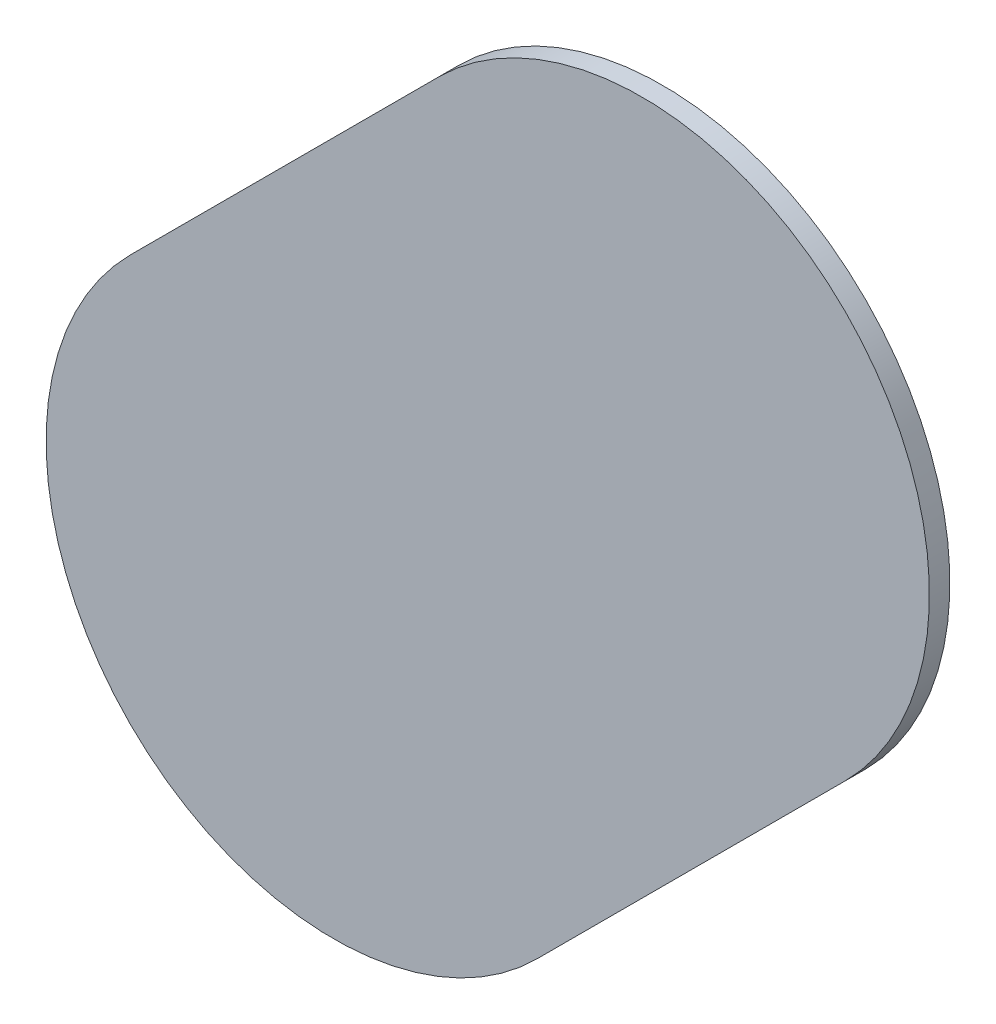
ISO-10303-21;
HEADER;
FILE_DESCRIPTION(('STEP AP214'),'2;1');
FILE_NAME('part.step','',(''),(''),'','','');
FILE_SCHEMA(('AUTOMOTIVE_DESIGN { 1 0 10303 214 1 1 1 1 }'));
ENDSEC;
DATA;
#1=APPLICATION_CONTEXT('core data for automotive mechanical design processes');
#2=APPLICATION_PROTOCOL_DEFINITION('international standard','automotive_design',2000,#1);
#3=PRODUCT_CONTEXT('',#1,'mechanical');
#4=PRODUCT('Part','Part','',(#3));
#5=PRODUCT_RELATED_PRODUCT_CATEGORY('part','',(#4));
#6=PRODUCT_DEFINITION_FORMATION('','',#4);
#7=PRODUCT_DEFINITION_CONTEXT('part definition',#1,'design');
#8=PRODUCT_DEFINITION('design','',#6,#7);
#9=PRODUCT_DEFINITION_SHAPE('','',#8);
#10=(LENGTH_UNIT() NAMED_UNIT(*) SI_UNIT(.MILLI.,.METRE.));
#11=(NAMED_UNIT(*) PLANE_ANGLE_UNIT() SI_UNIT($,.RADIAN.));
#12=(NAMED_UNIT(*) SI_UNIT($,.STERADIAN.) SOLID_ANGLE_UNIT());
#13=UNCERTAINTY_MEASURE_WITH_UNIT(LENGTH_MEASURE(1.E-05),#10,'distance_accuracy_value','');
#14=(GEOMETRIC_REPRESENTATION_CONTEXT(3) GLOBAL_UNCERTAINTY_ASSIGNED_CONTEXT((#13)) GLOBAL_UNIT_ASSIGNED_CONTEXT((#10,
#11,#12)) REPRESENTATION_CONTEXT('',''));
#15=CARTESIAN_POINT('',(0.,0.,0.));
#16=DIRECTION('',(0.,0.,1.));
#17=DIRECTION('',(1.,0.,0.));
#18=AXIS2_PLACEMENT_3D('',#15,#16,#17);
#19=CARTESIAN_POINT('',(81.32093464,80.64750444,0.));
#20=DIRECTION('',(-0.707106781186538,0.707106781186557,0.));
#21=DIRECTION('',(0.707106781186557,0.707106781186538,0.));
#22=AXIS2_PLACEMENT_3D('',#19,#20,#21);
#23=PLANE('',#22);
#24=DIRECTION('',(0.707106781186557,0.707106781186538,0.));
#25=VECTOR('',#24,1.);
#26=CARTESIAN_POINT('',(81.32093464,80.64750444,0.03556));
#27=LINE('',#26,#25);
#28=CARTESIAN_POINT('',(81.32093464,80.64750444,0.03556));
#29=VERTEX_POINT('',#28);
#30=CARTESIAN_POINT('',(81.85757314,81.18414294,0.03556));
#31=VERTEX_POINT('',#30);
#32=EDGE_CURVE('E11',#29,#31,#27,.T.);
#33=ORIENTED_EDGE('',*,*,#32,.F.);
#34=DIRECTION('',(0.,0.,1.));
#35=VECTOR('',#34,1.);
#36=CARTESIAN_POINT('',(81.32093464,80.64750444,0.));
#37=LINE('',#36,#35);
#38=CARTESIAN_POINT('',(81.32093464,80.64750444,0.));
#39=VERTEX_POINT('',#38);
#40=EDGE_CURVE('E24',#39,#29,#37,.T.);
#41=ORIENTED_EDGE('',*,*,#40,.F.);
#42=DIRECTION('',(0.707106781186557,0.707106781186538,0.));
#43=VECTOR('',#42,1.);
#44=CARTESIAN_POINT('',(81.32093464,80.64750444,0.));
#45=LINE('',#44,#43);
#46=CARTESIAN_POINT('',(81.85757314,81.18414294,0.));
#47=VERTEX_POINT('',#46);
#48=EDGE_CURVE('E75',#39,#47,#45,.T.);
#49=ORIENTED_EDGE('',*,*,#48,.T.);
#50=DIRECTION('',(0.,0.,1.));
#51=VECTOR('',#50,1.);
#52=CARTESIAN_POINT('',(81.85757314,81.18414294,0.));
#53=LINE('',#52,#51);
#54=EDGE_CURVE('E37',#47,#31,#53,.T.);
#55=ORIENTED_EDGE('',*,*,#54,.T.);
#56=EDGE_LOOP('',(#33,#41,#49,#55));
#57=FACE_BOUND('',#56,.T.);
#58=ADVANCED_FACE('F17',(#57),#23,.F.);
#59=CARTESIAN_POINT('',(81.50402038,81.5376957,0.));
#60=DIRECTION('',(0.,0.,-1.));
#61=DIRECTION('',(0.707106781186548,-0.707106781186548,0.));
#62=AXIS2_PLACEMENT_3D('',#59,#60,#61);
#63=CYLINDRICAL_SURFACE('',#62,0.499999108206439);
#64=CARTESIAN_POINT('',(81.50402038,81.5376957,0.03556));
#65=DIRECTION('',(0.,0.,1.));
#66=DIRECTION('',(0.707106781186548,-0.707106781186548,0.));
#67=AXIS2_PLACEMENT_3D('',#64,#65,#66);
#68=CIRCLE('',#67,0.499999108206439);
#69=CARTESIAN_POINT('',(81.15046762,81.89124846,0.03556));
#70=VERTEX_POINT('',#69);
#71=EDGE_CURVE('E83',#31,#70,#68,.T.);
#72=ORIENTED_EDGE('',*,*,#71,.F.);
#73=ORIENTED_EDGE('',*,*,#54,.F.);
#74=CARTESIAN_POINT('',(81.50402038,81.5376957,0.));
#75=DIRECTION('',(0.,0.,1.));
#76=DIRECTION('',(0.707106781186548,-0.707106781186548,0.));
#77=AXIS2_PLACEMENT_3D('',#74,#75,#76);
#78=CIRCLE('',#77,0.499999108206439);
#79=CARTESIAN_POINT('',(81.15046762,81.89124846,0.));
#80=VERTEX_POINT('',#79);
#81=EDGE_CURVE('E81',#47,#80,#78,.T.);
#82=ORIENTED_EDGE('',*,*,#81,.T.);
#83=DIRECTION('',(0.,0.,1.));
#84=VECTOR('',#83,1.);
#85=CARTESIAN_POINT('',(81.15046762,81.89124846,0.));
#86=LINE('',#85,#84);
#87=EDGE_CURVE('E67',#80,#70,#86,.T.);
#88=ORIENTED_EDGE('',*,*,#87,.T.);
#89=EDGE_LOOP('',(#72,#73,#82,#88));
#90=FACE_BOUND('',#89,.T.);
#91=ADVANCED_FACE('F89',(#90),#63,.T.);
#92=CARTESIAN_POINT('',(81.15046762,81.89124846,0.));
#93=DIRECTION('',(0.707106781186548,-0.707106781186548,0.));
#94=DIRECTION('',(-0.707106781186548,-0.707106781186548,0.));
#95=AXIS2_PLACEMENT_3D('',#92,#93,#94);
#96=PLANE('',#95);
#97=DIRECTION('',(-0.707106781186548,-0.707106781186548,0.));
#98=VECTOR('',#97,1.);
#99=CARTESIAN_POINT('',(81.15046762,81.89124846,0.03556));
#100=LINE('',#99,#98);
#101=CARTESIAN_POINT('',(80.61382912,81.35460996,0.03556));
#102=VERTEX_POINT('',#101);
#103=EDGE_CURVE('E71',#70,#102,#100,.T.);
#104=ORIENTED_EDGE('',*,*,#103,.F.);
#105=ORIENTED_EDGE('',*,*,#87,.F.);
#106=DIRECTION('',(-0.707106781186548,-0.707106781186548,0.));
#107=VECTOR('',#106,1.);
#108=CARTESIAN_POINT('',(81.15046762,81.89124846,0.));
#109=LINE('',#108,#107);
#110=CARTESIAN_POINT('',(80.61382912,81.35460996,0.));
#111=VERTEX_POINT('',#110);
#112=EDGE_CURVE('E63',#80,#111,#109,.T.);
#113=ORIENTED_EDGE('',*,*,#112,.T.);
#114=DIRECTION('',(0.,0.,1.));
#115=VECTOR('',#114,1.);
#116=CARTESIAN_POINT('',(80.61382912,81.35460996,0.));
#117=LINE('',#116,#115);
#118=EDGE_CURVE('E53',#111,#102,#117,.T.);
#119=ORIENTED_EDGE('',*,*,#118,.T.);
#120=EDGE_LOOP('',(#104,#105,#113,#119));
#121=FACE_BOUND('',#120,.T.);
#122=ADVANCED_FACE('F66',(#121),#96,.F.);
#123=CARTESIAN_POINT('',(80.96738188,81.0010572,0.));
#124=DIRECTION('',(0.,0.,-1.));
#125=DIRECTION('',(-0.707106781186548,0.707106781186548,0.));
#126=AXIS2_PLACEMENT_3D('',#123,#124,#125);
#127=CYLINDRICAL_SURFACE('',#126,0.499999108206432);
#128=CARTESIAN_POINT('',(80.96738188,81.0010572,0.03556));
#129=DIRECTION('',(0.,0.,1.));
#130=DIRECTION('',(-0.707106781186548,0.707106781186548,0.));
#131=AXIS2_PLACEMENT_3D('',#128,#129,#130);
#132=CIRCLE('',#131,0.499999108206432);
#133=EDGE_CURVE('E59',#102,#29,#132,.T.);
#134=ORIENTED_EDGE('',*,*,#133,.F.);
#135=ORIENTED_EDGE('',*,*,#118,.F.);
#136=CARTESIAN_POINT('',(80.96738188,81.0010572,0.));
#137=DIRECTION('',(0.,0.,1.));
#138=DIRECTION('',(-0.707106781186548,0.707106781186548,0.));
#139=AXIS2_PLACEMENT_3D('',#136,#137,#138);
#140=CIRCLE('',#139,0.499999108206432);
#141=EDGE_CURVE('E57',#111,#39,#140,.T.);
#142=ORIENTED_EDGE('',*,*,#141,.T.);
#143=ORIENTED_EDGE('',*,*,#40,.T.);
#144=EDGE_LOOP('',(#134,#135,#142,#143));
#145=FACE_BOUND('',#144,.T.);
#146=ADVANCED_FACE('F55',(#145),#127,.T.);
#147=CARTESIAN_POINT('',(81.32093464,80.64750444,0.));
#148=DIRECTION('',(0.,0.,-1.));
#149=DIRECTION('',(-1.,0.,0.));
#150=AXIS2_PLACEMENT_3D('',#147,#148,#149);
#151=PLANE('',#150);
#152=ORIENTED_EDGE('',*,*,#141,.F.);
#153=ORIENTED_EDGE('',*,*,#112,.F.);
#154=ORIENTED_EDGE('',*,*,#81,.F.);
#155=ORIENTED_EDGE('',*,*,#48,.F.);
#156=EDGE_LOOP('',(#152,#153,#154,#155));
#157=FACE_BOUND('',#156,.T.);
#158=ADVANCED_FACE('F74',(#157),#151,.T.);
#159=CARTESIAN_POINT('',(81.32093464,80.64750444,0.03556));
#160=DIRECTION('',(0.,0.,-1.));
#161=DIRECTION('',(-1.,0.,0.));
#162=AXIS2_PLACEMENT_3D('',#159,#160,#161);
#163=PLANE('',#162);
#164=ORIENTED_EDGE('',*,*,#32,.T.);
#165=ORIENTED_EDGE('',*,*,#71,.T.);
#166=ORIENTED_EDGE('',*,*,#103,.T.);
#167=ORIENTED_EDGE('',*,*,#133,.T.);
#168=EDGE_LOOP('',(#164,#165,#166,#167));
#169=FACE_BOUND('',#168,.T.);
#170=ADVANCED_FACE('F91',(#169),#163,.F.);
#171=CLOSED_SHELL('',(#58,#91,#122,#146,#158,#170));
#172=MANIFOLD_SOLID_BREP('B1',#171);
#173=ADVANCED_BREP_SHAPE_REPRESENTATION('',(#18,#172),#14);
#174=SHAPE_DEFINITION_REPRESENTATION(#9,#173);
ENDSEC;
END-ISO-10303-21;
